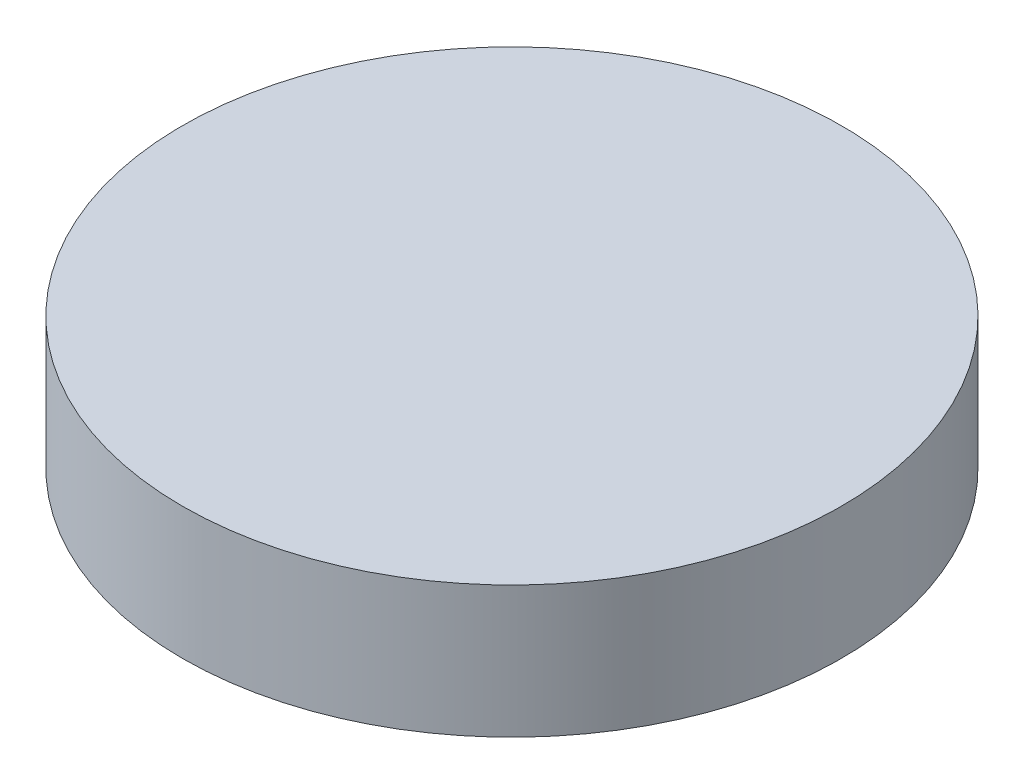
ISO-10303-21;
HEADER;
FILE_DESCRIPTION(('STEP AP214'),'2;1');
FILE_NAME('part.step','',(''),(''),'','','');
FILE_SCHEMA(('AUTOMOTIVE_DESIGN { 1 0 10303 214 1 1 1 1 }'));
ENDSEC;
DATA;
#1=APPLICATION_CONTEXT('core data for automotive mechanical design processes');
#2=APPLICATION_PROTOCOL_DEFINITION('international standard','automotive_design',2000,#1);
#3=PRODUCT_CONTEXT('',#1,'mechanical');
#4=PRODUCT('Part','Part','',(#3));
#5=PRODUCT_RELATED_PRODUCT_CATEGORY('part','',(#4));
#6=PRODUCT_DEFINITION_FORMATION('','',#4);
#7=PRODUCT_DEFINITION_CONTEXT('part definition',#1,'design');
#8=PRODUCT_DEFINITION('design','',#6,#7);
#9=PRODUCT_DEFINITION_SHAPE('','',#8);
#10=(LENGTH_UNIT() NAMED_UNIT(*) SI_UNIT(.MILLI.,.METRE.));
#11=(NAMED_UNIT(*) PLANE_ANGLE_UNIT() SI_UNIT($,.RADIAN.));
#12=(NAMED_UNIT(*) SI_UNIT($,.STERADIAN.) SOLID_ANGLE_UNIT());
#13=UNCERTAINTY_MEASURE_WITH_UNIT(LENGTH_MEASURE(1.E-05),#10,'distance_accuracy_value','');
#14=(GEOMETRIC_REPRESENTATION_CONTEXT(3) GLOBAL_UNCERTAINTY_ASSIGNED_CONTEXT((#13)) GLOBAL_UNIT_ASSIGNED_CONTEXT((#10,
#11,#12)) REPRESENTATION_CONTEXT('',''));
#15=CARTESIAN_POINT('',(0.,0.,0.));
#16=DIRECTION('',(0.,0.,1.));
#17=DIRECTION('',(1.,0.,0.));
#18=AXIS2_PLACEMENT_3D('',#15,#16,#17);
#19=CARTESIAN_POINT('',(0.,4.,0.));
#20=DIRECTION('',(0.,-1.,0.));
#21=DIRECTION('',(0.,0.,-1.));
#22=AXIS2_PLACEMENT_3D('',#19,#20,#21);
#23=CYLINDRICAL_SURFACE('',#22,10.);
#24=CARTESIAN_POINT('',(0.,4.,0.));
#25=DIRECTION('',(0.,1.,0.));
#26=DIRECTION('',(0.,0.,1.));
#27=AXIS2_PLACEMENT_3D('',#24,#25,#26);
#28=CIRCLE('',#27,10.);
#29=CARTESIAN_POINT('',(0.,4.,10.));
#30=VERTEX_POINT('',#29);
#31=EDGE_CURVE('E10',#30,#30,#28,.T.);
#32=ORIENTED_EDGE('',*,*,#31,.F.);
#33=EDGE_LOOP('',(#32));
#34=FACE_BOUND('',#33,.T.);
#35=CARTESIAN_POINT('',(0.,0.,0.));
#36=DIRECTION('',(0.,1.,0.));
#37=DIRECTION('',(0.,0.,1.));
#38=AXIS2_PLACEMENT_3D('',#35,#36,#37);
#39=CIRCLE('',#38,10.);
#40=CARTESIAN_POINT('',(0.,0.,10.));
#41=VERTEX_POINT('',#40);
#42=EDGE_CURVE('E40',#41,#41,#39,.T.);
#43=ORIENTED_EDGE('',*,*,#42,.T.);
#44=EDGE_LOOP('',(#43));
#45=FACE_BOUND('',#44,.T.);
#46=ADVANCED_FACE('F37',(#34,#45),#23,.T.);
#47=CARTESIAN_POINT('',(0.,4.,0.));
#48=DIRECTION('',(0.,1.,0.));
#49=DIRECTION('',(0.,0.,1.));
#50=AXIS2_PLACEMENT_3D('',#47,#48,#49);
#51=PLANE('',#50);
#52=ORIENTED_EDGE('',*,*,#31,.T.);
#53=EDGE_LOOP('',(#52));
#54=FACE_BOUND('',#53,.T.);
#55=ADVANCED_FACE('F52',(#54),#51,.T.);
#56=CARTESIAN_POINT('',(0.,0.,0.));
#57=DIRECTION('',(0.,1.,0.));
#58=DIRECTION('',(0.,0.,1.));
#59=AXIS2_PLACEMENT_3D('',#56,#57,#58);
#60=PLANE('',#59);
#61=ORIENTED_EDGE('',*,*,#42,.F.);
#62=EDGE_LOOP('',(#61));
#63=FACE_BOUND('',#62,.T.);
#64=ADVANCED_FACE('F50',(#63),#60,.F.);
#65=CLOSED_SHELL('',(#46,#55,#64));
#66=MANIFOLD_SOLID_BREP('B2',#65);
#67=ADVANCED_BREP_SHAPE_REPRESENTATION('',(#18,#66),#14);
#68=SHAPE_DEFINITION_REPRESENTATION(#9,#67);
ENDSEC;
END-ISO-10303-21;
